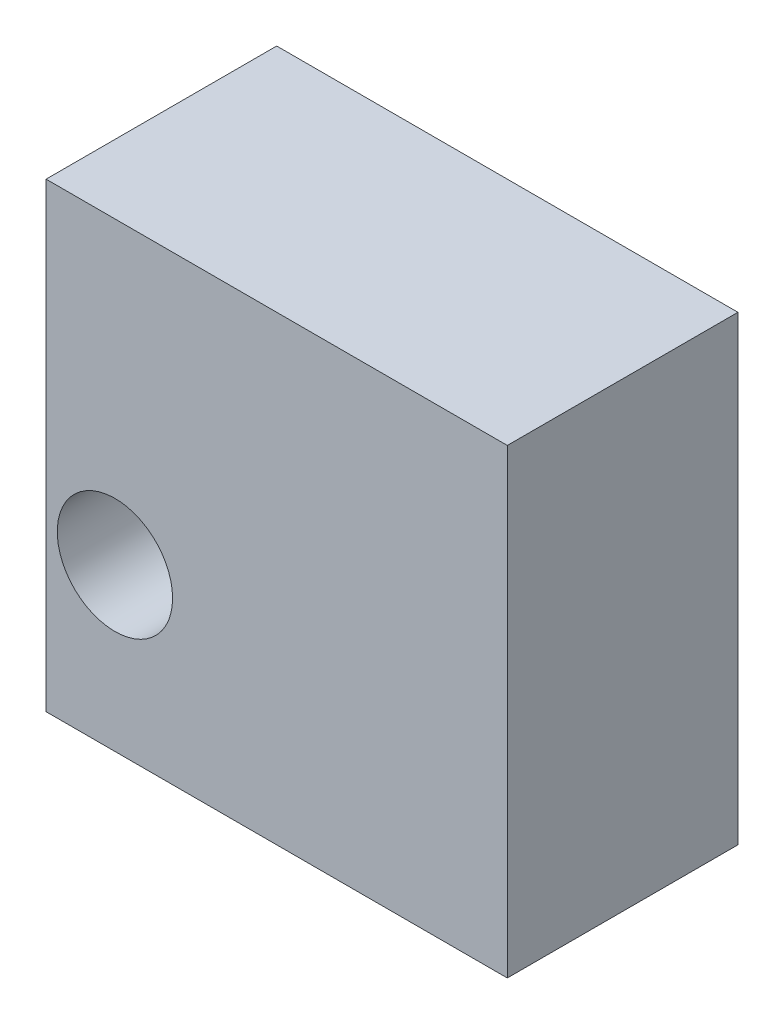
ISO-10303-21;
HEADER;
FILE_DESCRIPTION(('STEP AP214'),'2;1');
FILE_NAME('part.step','',(''),(''),'','','');
FILE_SCHEMA(('AUTOMOTIVE_DESIGN { 1 0 10303 214 1 1 1 1 }'));
ENDSEC;
DATA;
#1=APPLICATION_CONTEXT('core data for automotive mechanical design processes');
#2=APPLICATION_PROTOCOL_DEFINITION('international standard','automotive_design',2000,#1);
#3=PRODUCT_CONTEXT('',#1,'mechanical');
#4=PRODUCT('Part','Part','',(#3));
#5=PRODUCT_RELATED_PRODUCT_CATEGORY('part','',(#4));
#6=PRODUCT_DEFINITION_FORMATION('','',#4);
#7=PRODUCT_DEFINITION_CONTEXT('part definition',#1,'design');
#8=PRODUCT_DEFINITION('design','',#6,#7);
#9=PRODUCT_DEFINITION_SHAPE('','',#8);
#10=(LENGTH_UNIT() NAMED_UNIT(*) SI_UNIT(.MILLI.,.METRE.));
#11=(NAMED_UNIT(*) PLANE_ANGLE_UNIT() SI_UNIT($,.RADIAN.));
#12=(NAMED_UNIT(*) SI_UNIT($,.STERADIAN.) SOLID_ANGLE_UNIT());
#13=UNCERTAINTY_MEASURE_WITH_UNIT(LENGTH_MEASURE(1.E-05),#10,'distance_accuracy_value','');
#14=(GEOMETRIC_REPRESENTATION_CONTEXT(3) GLOBAL_UNCERTAINTY_ASSIGNED_CONTEXT((#13)) GLOBAL_UNIT_ASSIGNED_CONTEXT((#10,
#11,#12)) REPRESENTATION_CONTEXT('',''));
#15=CARTESIAN_POINT('',(0.,0.,0.));
#16=DIRECTION('',(0.,0.,1.));
#17=DIRECTION('',(1.,0.,0.));
#18=AXIS2_PLACEMENT_3D('',#15,#16,#17);
#19=CARTESIAN_POINT('',(0.,0.,10.));
#20=DIRECTION('',(1.,0.,0.));
#21=DIRECTION('',(0.,0.,-1.));
#22=AXIS2_PLACEMENT_3D('',#19,#20,#21);
#23=PLANE('',#22);
#24=DIRECTION('',(0.,-1.,0.));
#25=VECTOR('',#24,1.);
#26=CARTESIAN_POINT('',(0.,0.,0.));
#27=LINE('',#26,#25);
#28=CARTESIAN_POINT('',(0.,20.,0.));
#29=VERTEX_POINT('',#28);
#30=CARTESIAN_POINT('',(0.,0.,0.));
#31=VERTEX_POINT('',#30);
#32=EDGE_CURVE('E106',#29,#31,#27,.T.);
#33=ORIENTED_EDGE('',*,*,#32,.T.);
#34=DIRECTION('',(0.,0.,-1.));
#35=VECTOR('',#34,1.);
#36=CARTESIAN_POINT('',(0.,0.,10.));
#37=LINE('',#36,#35);
#38=CARTESIAN_POINT('',(0.,0.,10.));
#39=VERTEX_POINT('',#38);
#40=EDGE_CURVE('E11',#39,#31,#37,.T.);
#41=ORIENTED_EDGE('',*,*,#40,.F.);
#42=DIRECTION('',(0.,-1.,0.));
#43=VECTOR('',#42,1.);
#44=CARTESIAN_POINT('',(0.,0.,10.));
#45=LINE('',#44,#43);
#46=CARTESIAN_POINT('',(0.,20.,10.));
#47=VERTEX_POINT('',#46);
#48=EDGE_CURVE('E94',#47,#39,#45,.T.);
#49=ORIENTED_EDGE('',*,*,#48,.F.);
#50=DIRECTION('',(0.,0.,-1.));
#51=VECTOR('',#50,1.);
#52=CARTESIAN_POINT('',(0.,20.,10.));
#53=LINE('',#52,#51);
#54=EDGE_CURVE('E105',#47,#29,#53,.T.);
#55=ORIENTED_EDGE('',*,*,#54,.T.);
#56=EDGE_LOOP('',(#33,#41,#49,#55));
#57=FACE_BOUND('',#56,.T.);
#58=ADVANCED_FACE('F43',(#57),#23,.F.);
#59=CARTESIAN_POINT('',(0.,0.,10.));
#60=DIRECTION('',(0.,1.,0.));
#61=DIRECTION('',(0.,0.,1.));
#62=AXIS2_PLACEMENT_3D('',#59,#60,#61);
#63=PLANE('',#62);
#64=DIRECTION('',(1.,0.,0.));
#65=VECTOR('',#64,1.);
#66=CARTESIAN_POINT('',(0.,0.,0.));
#67=LINE('',#66,#65);
#68=CARTESIAN_POINT('',(20.,0.,0.));
#69=VERTEX_POINT('',#68);
#70=EDGE_CURVE('E98',#31,#69,#67,.T.);
#71=ORIENTED_EDGE('',*,*,#70,.T.);
#72=DIRECTION('',(0.,0.,-1.));
#73=VECTOR('',#72,1.);
#74=CARTESIAN_POINT('',(20.,0.,10.));
#75=LINE('',#74,#73);
#76=CARTESIAN_POINT('',(20.,0.,10.));
#77=VERTEX_POINT('',#76);
#78=EDGE_CURVE('E51',#77,#69,#75,.T.);
#79=ORIENTED_EDGE('',*,*,#78,.F.);
#80=DIRECTION('',(1.,0.,0.));
#81=VECTOR('',#80,1.);
#82=CARTESIAN_POINT('',(0.,0.,10.));
#83=LINE('',#82,#81);
#84=EDGE_CURVE('E90',#39,#77,#83,.T.);
#85=ORIENTED_EDGE('',*,*,#84,.F.);
#86=ORIENTED_EDGE('',*,*,#40,.T.);
#87=EDGE_LOOP('',(#71,#79,#85,#86));
#88=FACE_BOUND('',#87,.T.);
#89=ADVANCED_FACE('F100',(#88),#63,.F.);
#90=CARTESIAN_POINT('',(20.,0.,10.));
#91=DIRECTION('',(-1.,0.,0.));
#92=DIRECTION('',(0.,0.,1.));
#93=AXIS2_PLACEMENT_3D('',#90,#91,#92);
#94=PLANE('',#93);
#95=DIRECTION('',(0.,1.,0.));
#96=VECTOR('',#95,1.);
#97=CARTESIAN_POINT('',(20.,0.,0.));
#98=LINE('',#97,#96);
#99=CARTESIAN_POINT('',(20.,20.,0.));
#100=VERTEX_POINT('',#99);
#101=EDGE_CURVE('E78',#69,#100,#98,.T.);
#102=ORIENTED_EDGE('',*,*,#101,.T.);
#103=DIRECTION('',(0.,0.,-1.));
#104=VECTOR('',#103,1.);
#105=CARTESIAN_POINT('',(20.,20.,10.));
#106=LINE('',#105,#104);
#107=CARTESIAN_POINT('',(20.,20.,10.));
#108=VERTEX_POINT('',#107);
#109=EDGE_CURVE('E97',#108,#100,#106,.T.);
#110=ORIENTED_EDGE('',*,*,#109,.F.);
#111=DIRECTION('',(0.,1.,0.));
#112=VECTOR('',#111,1.);
#113=CARTESIAN_POINT('',(20.,0.,10.));
#114=LINE('',#113,#112);
#115=EDGE_CURVE('E95',#77,#108,#114,.T.);
#116=ORIENTED_EDGE('',*,*,#115,.F.);
#117=ORIENTED_EDGE('',*,*,#78,.T.);
#118=EDGE_LOOP('',(#102,#110,#116,#117));
#119=FACE_BOUND('',#118,.T.);
#120=ADVANCED_FACE('F99',(#119),#94,.F.);
#121=CARTESIAN_POINT('',(0.,20.,10.));
#122=DIRECTION('',(0.,-1.,0.));
#123=DIRECTION('',(0.,0.,-1.));
#124=AXIS2_PLACEMENT_3D('',#121,#122,#123);
#125=PLANE('',#124);
#126=DIRECTION('',(-1.,0.,0.));
#127=VECTOR('',#126,1.);
#128=CARTESIAN_POINT('',(0.,20.,0.));
#129=LINE('',#128,#127);
#130=EDGE_CURVE('E82',#100,#29,#129,.T.);
#131=ORIENTED_EDGE('',*,*,#130,.T.);
#132=ORIENTED_EDGE('',*,*,#54,.F.);
#133=DIRECTION('',(-1.,0.,0.));
#134=VECTOR('',#133,1.);
#135=CARTESIAN_POINT('',(0.,20.,10.));
#136=LINE('',#135,#134);
#137=EDGE_CURVE('E56',#108,#47,#136,.T.);
#138=ORIENTED_EDGE('',*,*,#137,.F.);
#139=ORIENTED_EDGE('',*,*,#109,.T.);
#140=EDGE_LOOP('',(#131,#132,#138,#139));
#141=FACE_BOUND('',#140,.T.);
#142=ADVANCED_FACE('F111',(#141),#125,.F.);
#143=CARTESIAN_POINT('',(0.,0.,10.));
#144=DIRECTION('',(0.,0.,-1.));
#145=DIRECTION('',(-1.,0.,0.));
#146=AXIS2_PLACEMENT_3D('',#143,#144,#145);
#147=PLANE('',#146);
#148=CARTESIAN_POINT('',(2.98535394983901,7.00519838488844,10.));
#149=DIRECTION('',(0.,0.,1.));
#150=DIRECTION('',(1.,0.,0.));
#151=AXIS2_PLACEMENT_3D('',#148,#149,#150);
#152=CIRCLE('',#151,2.50000000000001);
#153=CARTESIAN_POINT('',(5.48535394983902,7.00519838488844,10.));
#154=VERTEX_POINT('',#153);
#155=EDGE_CURVE('E122',#154,#154,#152,.T.);
#156=ORIENTED_EDGE('',*,*,#155,.F.);
#157=EDGE_LOOP('',(#156));
#158=FACE_BOUND('',#157,.T.);
#159=ORIENTED_EDGE('',*,*,#48,.T.);
#160=ORIENTED_EDGE('',*,*,#84,.T.);
#161=ORIENTED_EDGE('',*,*,#115,.T.);
#162=ORIENTED_EDGE('',*,*,#137,.T.);
#163=EDGE_LOOP('',(#159,#160,#161,#162));
#164=FACE_BOUND('',#163,.T.);
#165=ADVANCED_FACE('F89',(#158,#164),#147,.F.);
#166=CARTESIAN_POINT('',(0.,0.,0.));
#167=DIRECTION('',(0.,0.,-1.));
#168=DIRECTION('',(-1.,0.,0.));
#169=AXIS2_PLACEMENT_3D('',#166,#167,#168);
#170=PLANE('',#169);
#171=CARTESIAN_POINT('',(2.98535394983901,7.00519838488844,0.));
#172=DIRECTION('',(0.,0.,1.));
#173=DIRECTION('',(1.,0.,0.));
#174=AXIS2_PLACEMENT_3D('',#171,#172,#173);
#175=CIRCLE('',#174,2.50000000000001);
#176=CARTESIAN_POINT('',(5.48535394983902,7.00519838488844,0.));
#177=VERTEX_POINT('',#176);
#178=EDGE_CURVE('E108',#177,#177,#175,.T.);
#179=ORIENTED_EDGE('',*,*,#178,.T.);
#180=EDGE_LOOP('',(#179));
#181=FACE_BOUND('',#180,.T.);
#182=ORIENTED_EDGE('',*,*,#32,.F.);
#183=ORIENTED_EDGE('',*,*,#130,.F.);
#184=ORIENTED_EDGE('',*,*,#101,.F.);
#185=ORIENTED_EDGE('',*,*,#70,.F.);
#186=EDGE_LOOP('',(#182,#183,#184,#185));
#187=FACE_BOUND('',#186,.T.);
#188=ADVANCED_FACE('F119',(#181,#187),#170,.T.);
#189=CARTESIAN_POINT('',(2.98535394983901,7.00519838488844,10.));
#190=DIRECTION('',(0.,0.,1.));
#191=DIRECTION('',(1.,0.,0.));
#192=AXIS2_PLACEMENT_3D('',#189,#190,#191);
#193=CYLINDRICAL_SURFACE('',#192,2.50000000000001);
#194=ORIENTED_EDGE('',*,*,#178,.F.);
#195=EDGE_LOOP('',(#194));
#196=FACE_BOUND('',#195,.T.);
#197=ORIENTED_EDGE('',*,*,#155,.T.);
#198=EDGE_LOOP('',(#197));
#199=FACE_BOUND('',#198,.T.);
#200=ADVANCED_FACE('F127',(#196,#199),#193,.F.);
#201=CLOSED_SHELL('',(#58,#89,#120,#142,#165,#188,#200));
#202=MANIFOLD_SOLID_BREP('B2',#201);
#203=ADVANCED_BREP_SHAPE_REPRESENTATION('',(#18,#202),#14);
#204=SHAPE_DEFINITION_REPRESENTATION(#9,#203);
ENDSEC;
END-ISO-10303-21;
